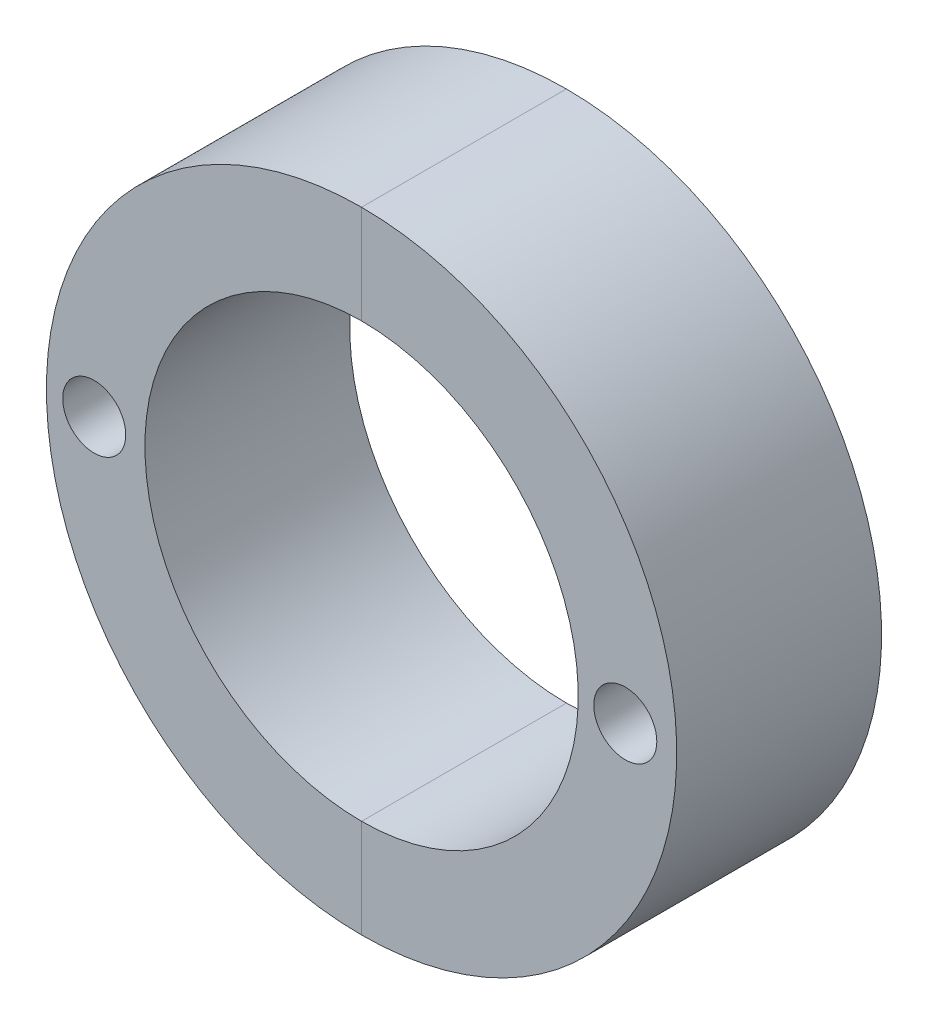
ISO-10303-21;
HEADER;
FILE_DESCRIPTION(('STEP AP214'),'2;1');
FILE_NAME('part.step','',(''),(''),'','','');
FILE_SCHEMA(('AUTOMOTIVE_DESIGN { 1 0 10303 214 1 1 1 1 }'));
ENDSEC;
DATA;
#1=APPLICATION_CONTEXT('core data for automotive mechanical design processes');
#2=APPLICATION_PROTOCOL_DEFINITION('international standard','automotive_design',2000,#1);
#3=PRODUCT_CONTEXT('',#1,'mechanical');
#4=PRODUCT('Part','Part','',(#3));
#5=PRODUCT_RELATED_PRODUCT_CATEGORY('part','',(#4));
#6=PRODUCT_DEFINITION_FORMATION('','',#4);
#7=PRODUCT_DEFINITION_CONTEXT('part definition',#1,'design');
#8=PRODUCT_DEFINITION('design','',#6,#7);
#9=PRODUCT_DEFINITION_SHAPE('','',#8);
#10=(LENGTH_UNIT() NAMED_UNIT(*) SI_UNIT(.MILLI.,.METRE.));
#11=(NAMED_UNIT(*) PLANE_ANGLE_UNIT() SI_UNIT($,.RADIAN.));
#12=(NAMED_UNIT(*) SI_UNIT($,.STERADIAN.) SOLID_ANGLE_UNIT());
#13=UNCERTAINTY_MEASURE_WITH_UNIT(LENGTH_MEASURE(1.E-05),#10,'distance_accuracy_value','');
#14=(GEOMETRIC_REPRESENTATION_CONTEXT(3) GLOBAL_UNCERTAINTY_ASSIGNED_CONTEXT((#13)) GLOBAL_UNIT_ASSIGNED_CONTEXT((#10,
#11,#12)) REPRESENTATION_CONTEXT('',''));
#15=CARTESIAN_POINT('',(0.,0.,0.));
#16=DIRECTION('',(0.,0.,1.));
#17=DIRECTION('',(1.,0.,0.));
#18=AXIS2_PLACEMENT_3D('',#15,#16,#17);
#19=CARTESIAN_POINT('',(0.,44.4067535270988,-0.01));
#20=DIRECTION('',(-1.,0.,0.));
#21=DIRECTION('',(0.,0.,1.));
#22=AXIS2_PLACEMENT_3D('',#19,#20,#21);
#23=PLANE('',#22);
#24=DIRECTION('',(0.,-1.,0.));
#25=VECTOR('',#24,1.);
#26=CARTESIAN_POINT('',(0.,0.,0.));
#27=LINE('',#26,#25);
#28=CARTESIAN_POINT('',(0.,-27.5,0.));
#29=VERTEX_POINT('',#28);
#30=CARTESIAN_POINT('',(0.,-40.,0.));
#31=VERTEX_POINT('',#30);
#32=EDGE_CURVE('E123',#29,#31,#27,.T.);
#33=ORIENTED_EDGE('',*,*,#32,.T.);
#34=DIRECTION('',(0.,0.,-1.));
#35=VECTOR('',#34,1.);
#36=CARTESIAN_POINT('',(0.,-40.,26.));
#37=LINE('',#36,#35);
#38=CARTESIAN_POINT('',(0.,-40.,26.));
#39=VERTEX_POINT('',#38);
#40=EDGE_CURVE('E128',#31,#39,#37,.F.);
#41=ORIENTED_EDGE('',*,*,#40,.T.);
#42=DIRECTION('',(0.,-1.,0.));
#43=VECTOR('',#42,1.);
#44=CARTESIAN_POINT('',(0.,0.,26.));
#45=LINE('',#44,#43);
#46=CARTESIAN_POINT('',(0.,-27.5,26.));
#47=VERTEX_POINT('',#46);
#48=EDGE_CURVE('E100',#47,#39,#45,.T.);
#49=ORIENTED_EDGE('',*,*,#48,.F.);
#50=DIRECTION('',(0.,0.,1.));
#51=VECTOR('',#50,1.);
#52=CARTESIAN_POINT('',(0.,-27.5,0.));
#53=LINE('',#52,#51);
#54=EDGE_CURVE('E135',#47,#29,#53,.F.);
#55=ORIENTED_EDGE('',*,*,#54,.T.);
#56=EDGE_LOOP('',(#33,#41,#49,#55));
#57=FACE_BOUND('',#56,.T.);
#58=ADVANCED_FACE('F74',(#57),#23,.T.);
#59=CARTESIAN_POINT('',(0.,40.,26.));
#60=VERTEX_POINT('',#59);
#61=CARTESIAN_POINT('',(0.,27.5,26.));
#62=VERTEX_POINT('',#61);
#63=EDGE_CURVE('E90',#60,#62,#45,.T.);
#64=ORIENTED_EDGE('',*,*,#63,.F.);
#65=DIRECTION('',(0.,0.,-1.));
#66=VECTOR('',#65,1.);
#67=CARTESIAN_POINT('',(0.,40.,26.));
#68=LINE('',#67,#66);
#69=CARTESIAN_POINT('',(0.,40.,0.));
#70=VERTEX_POINT('',#69);
#71=EDGE_CURVE('E129',#60,#70,#68,.T.);
#72=ORIENTED_EDGE('',*,*,#71,.T.);
#73=CARTESIAN_POINT('',(0.,27.5,0.));
#74=VERTEX_POINT('',#73);
#75=EDGE_CURVE('E118',#70,#74,#27,.T.);
#76=ORIENTED_EDGE('',*,*,#75,.T.);
#77=DIRECTION('',(0.,0.,1.));
#78=VECTOR('',#77,1.);
#79=CARTESIAN_POINT('',(0.,27.5,0.));
#80=LINE('',#79,#78);
#81=EDGE_CURVE('E126',#74,#62,#80,.T.);
#82=ORIENTED_EDGE('',*,*,#81,.T.);
#83=EDGE_LOOP('',(#64,#72,#76,#82));
#84=FACE_BOUND('',#83,.T.);
#85=ADVANCED_FACE('F130',(#84),#23,.T.);
#86=CARTESIAN_POINT('',(0.,0.,26.));
#87=DIRECTION('',(0.,0.,-1.));
#88=DIRECTION('',(-1.,0.,0.));
#89=AXIS2_PLACEMENT_3D('',#86,#87,#88);
#90=CYLINDRICAL_SURFACE('',#89,40.);
#91=ORIENTED_EDGE('',*,*,#71,.F.);
#92=CARTESIAN_POINT('',(0.,0.,26.));
#93=DIRECTION('',(0.,0.,1.));
#94=DIRECTION('',(1.,0.,0.));
#95=AXIS2_PLACEMENT_3D('',#92,#93,#94);
#96=CIRCLE('',#95,40.);
#97=EDGE_CURVE('E136',#39,#60,#96,.T.);
#98=ORIENTED_EDGE('',*,*,#97,.F.);
#99=ORIENTED_EDGE('',*,*,#40,.F.);
#100=CARTESIAN_POINT('',(0.,0.,0.));
#101=DIRECTION('',(0.,0.,1.));
#102=DIRECTION('',(1.,0.,0.));
#103=AXIS2_PLACEMENT_3D('',#100,#101,#102);
#104=CIRCLE('',#103,40.);
#105=EDGE_CURVE('E127',#31,#70,#104,.T.);
#106=ORIENTED_EDGE('',*,*,#105,.T.);
#107=EDGE_LOOP('',(#91,#98,#99,#106));
#108=FACE_BOUND('',#107,.T.);
#109=ADVANCED_FACE('F145',(#108),#90,.T.);
#110=CARTESIAN_POINT('',(0.,0.,26.));
#111=DIRECTION('',(0.,0.,1.));
#112=DIRECTION('',(1.,0.,0.));
#113=AXIS2_PLACEMENT_3D('',#110,#111,#112);
#114=PLANE('',#113);
#115=CARTESIAN_POINT('',(33.4719622595131,0.,26.));
#116=DIRECTION('',(0.,0.,1.));
#117=DIRECTION('',(1.,0.,0.));
#118=AXIS2_PLACEMENT_3D('',#115,#116,#117);
#119=CIRCLE('',#118,4.00000000000001);
#120=CARTESIAN_POINT('',(37.4719622595131,0.,26.));
#121=VERTEX_POINT('',#120);
#122=EDGE_CURVE('E139',#121,#121,#119,.T.);
#123=ORIENTED_EDGE('',*,*,#122,.F.);
#124=EDGE_LOOP('',(#123));
#125=FACE_BOUND('',#124,.T.);
#126=ORIENTED_EDGE('',*,*,#97,.T.);
#127=ORIENTED_EDGE('',*,*,#63,.T.);
#128=CARTESIAN_POINT('',(0.,0.,26.));
#129=DIRECTION('',(0.,0.,1.));
#130=DIRECTION('',(1.,0.,0.));
#131=AXIS2_PLACEMENT_3D('',#128,#129,#130);
#132=CIRCLE('',#131,27.5);
#133=EDGE_CURVE('E15',#47,#62,#132,.T.);
#134=ORIENTED_EDGE('',*,*,#133,.F.);
#135=ORIENTED_EDGE('',*,*,#48,.T.);
#136=EDGE_LOOP('',(#126,#127,#134,#135));
#137=FACE_BOUND('',#136,.T.);
#138=ADVANCED_FACE('F156',(#125,#137),#114,.T.);
#139=CARTESIAN_POINT('',(0.,0.,0.));
#140=DIRECTION('',(0.,0.,1.));
#141=DIRECTION('',(1.,0.,0.));
#142=AXIS2_PLACEMENT_3D('',#139,#140,#141);
#143=PLANE('',#142);
#144=CARTESIAN_POINT('',(33.4719622595131,0.,0.));
#145=DIRECTION('',(0.,0.,1.));
#146=DIRECTION('',(1.,0.,0.));
#147=AXIS2_PLACEMENT_3D('',#144,#145,#146);
#148=CIRCLE('',#147,4.00000000000001);
#149=CARTESIAN_POINT('',(37.4719622595131,0.,0.));
#150=VERTEX_POINT('',#149);
#151=EDGE_CURVE('E132',#150,#150,#148,.T.);
#152=ORIENTED_EDGE('',*,*,#151,.T.);
#153=EDGE_LOOP('',(#152));
#154=FACE_BOUND('',#153,.T.);
#155=ORIENTED_EDGE('',*,*,#75,.F.);
#156=ORIENTED_EDGE('',*,*,#105,.F.);
#157=ORIENTED_EDGE('',*,*,#32,.F.);
#158=CARTESIAN_POINT('',(0.,0.,0.));
#159=DIRECTION('',(0.,0.,1.));
#160=DIRECTION('',(1.,0.,0.));
#161=AXIS2_PLACEMENT_3D('',#158,#159,#160);
#162=CIRCLE('',#161,27.5);
#163=EDGE_CURVE('E84',#29,#74,#162,.T.);
#164=ORIENTED_EDGE('',*,*,#163,.T.);
#165=EDGE_LOOP('',(#155,#156,#157,#164));
#166=FACE_BOUND('',#165,.T.);
#167=ADVANCED_FACE('F117',(#154,#166),#143,.F.);
#168=CARTESIAN_POINT('',(0.,0.,0.));
#169=DIRECTION('',(0.,0.,1.));
#170=DIRECTION('',(1.,0.,0.));
#171=AXIS2_PLACEMENT_3D('',#168,#169,#170);
#172=CYLINDRICAL_SURFACE('',#171,27.5);
#173=ORIENTED_EDGE('',*,*,#54,.F.);
#174=ORIENTED_EDGE('',*,*,#133,.T.);
#175=ORIENTED_EDGE('',*,*,#81,.F.);
#176=ORIENTED_EDGE('',*,*,#163,.F.);
#177=EDGE_LOOP('',(#173,#174,#175,#176));
#178=FACE_BOUND('',#177,.T.);
#179=ADVANCED_FACE('F76',(#178),#172,.F.);
#180=CARTESIAN_POINT('',(33.4719622595131,0.,0.));
#181=DIRECTION('',(0.,0.,1.));
#182=DIRECTION('',(1.,0.,0.));
#183=AXIS2_PLACEMENT_3D('',#180,#181,#182);
#184=CYLINDRICAL_SURFACE('',#183,4.00000000000001);
#185=ORIENTED_EDGE('',*,*,#151,.F.);
#186=EDGE_LOOP('',(#185));
#187=FACE_BOUND('',#186,.T.);
#188=ORIENTED_EDGE('',*,*,#122,.T.);
#189=EDGE_LOOP('',(#188));
#190=FACE_BOUND('',#189,.T.);
#191=ADVANCED_FACE('F152',(#187,#190),#184,.F.);
#192=CLOSED_SHELL('',(#58,#85,#109,#138,#167,#179,#191));
#193=MANIFOLD_SOLID_BREP('B2',#192);
#194=CARTESIAN_POINT('',(0.,44.4067535270988,-0.01));
#195=DIRECTION('',(-1.,0.,0.));
#196=DIRECTION('',(0.,0.,1.));
#197=AXIS2_PLACEMENT_3D('',#194,#195,#196);
#198=PLANE('',#197);
#199=DIRECTION('',(0.,-1.,0.));
#200=VECTOR('',#199,1.);
#201=CARTESIAN_POINT('',(0.,0.,0.));
#202=LINE('',#201,#200);
#203=CARTESIAN_POINT('',(0.,-27.5,0.));
#204=VERTEX_POINT('',#203);
#205=CARTESIAN_POINT('',(0.,-40.,0.));
#206=VERTEX_POINT('',#205);
#207=EDGE_CURVE('E270',#204,#206,#202,.T.);
#208=ORIENTED_EDGE('',*,*,#207,.F.);
#209=DIRECTION('',(0.,0.,1.));
#210=VECTOR('',#209,1.);
#211=CARTESIAN_POINT('',(0.,-27.5,0.));
#212=LINE('',#211,#210);
#213=CARTESIAN_POINT('',(0.,-27.5,26.));
#214=VERTEX_POINT('',#213);
#215=EDGE_CURVE('E273',#214,#204,#212,.F.);
#216=ORIENTED_EDGE('',*,*,#215,.F.);
#217=DIRECTION('',(0.,-1.,0.));
#218=VECTOR('',#217,1.);
#219=CARTESIAN_POINT('',(0.,0.,26.));
#220=LINE('',#219,#218);
#221=CARTESIAN_POINT('',(0.,-40.,26.));
#222=VERTEX_POINT('',#221);
#223=EDGE_CURVE('E75',#214,#222,#220,.T.);
#224=ORIENTED_EDGE('',*,*,#223,.T.);
#225=DIRECTION('',(0.,0.,-1.));
#226=VECTOR('',#225,1.);
#227=CARTESIAN_POINT('',(0.,-40.,26.));
#228=LINE('',#227,#226);
#229=EDGE_CURVE('E222',#206,#222,#228,.F.);
#230=ORIENTED_EDGE('',*,*,#229,.F.);
#231=EDGE_LOOP('',(#208,#216,#224,#230));
#232=FACE_BOUND('',#231,.T.);
#233=ADVANCED_FACE('F217',(#232),#198,.F.);
#234=CARTESIAN_POINT('',(0.,40.,26.));
#235=VERTEX_POINT('',#234);
#236=CARTESIAN_POINT('',(0.,27.5,26.));
#237=VERTEX_POINT('',#236);
#238=EDGE_CURVE('E226',#235,#237,#220,.T.);
#239=ORIENTED_EDGE('',*,*,#238,.T.);
#240=DIRECTION('',(0.,0.,1.));
#241=VECTOR('',#240,1.);
#242=CARTESIAN_POINT('',(0.,27.5,0.));
#243=LINE('',#242,#241);
#244=CARTESIAN_POINT('',(0.,27.5,0.));
#245=VERTEX_POINT('',#244);
#246=EDGE_CURVE('E267',#245,#237,#243,.T.);
#247=ORIENTED_EDGE('',*,*,#246,.F.);
#248=CARTESIAN_POINT('',(0.,40.,0.));
#249=VERTEX_POINT('',#248);
#250=EDGE_CURVE('E257',#249,#245,#202,.T.);
#251=ORIENTED_EDGE('',*,*,#250,.F.);
#252=DIRECTION('',(0.,0.,-1.));
#253=VECTOR('',#252,1.);
#254=CARTESIAN_POINT('',(0.,40.,26.));
#255=LINE('',#254,#253);
#256=EDGE_CURVE('E235',#235,#249,#255,.T.);
#257=ORIENTED_EDGE('',*,*,#256,.F.);
#258=EDGE_LOOP('',(#239,#247,#251,#257));
#259=FACE_BOUND('',#258,.T.);
#260=ADVANCED_FACE('F269',(#259),#198,.F.);
#261=CARTESIAN_POINT('',(0.,0.,26.));
#262=DIRECTION('',(0.,0.,-1.));
#263=DIRECTION('',(-1.,0.,0.));
#264=AXIS2_PLACEMENT_3D('',#261,#262,#263);
#265=CYLINDRICAL_SURFACE('',#264,40.);
#266=CARTESIAN_POINT('',(0.,0.,26.));
#267=DIRECTION('',(0.,0.,1.));
#268=DIRECTION('',(1.,0.,0.));
#269=AXIS2_PLACEMENT_3D('',#266,#267,#268);
#270=CIRCLE('',#269,40.);
#271=EDGE_CURVE('E274',#235,#222,#270,.T.);
#272=ORIENTED_EDGE('',*,*,#271,.F.);
#273=ORIENTED_EDGE('',*,*,#256,.T.);
#274=CARTESIAN_POINT('',(0.,0.,0.));
#275=DIRECTION('',(0.,0.,1.));
#276=DIRECTION('',(1.,0.,0.));
#277=AXIS2_PLACEMENT_3D('',#274,#275,#276);
#278=CIRCLE('',#277,40.);
#279=EDGE_CURVE('E266',#249,#206,#278,.T.);
#280=ORIENTED_EDGE('',*,*,#279,.T.);
#281=ORIENTED_EDGE('',*,*,#229,.T.);
#282=EDGE_LOOP('',(#272,#273,#280,#281));
#283=FACE_BOUND('',#282,.T.);
#284=ADVANCED_FACE('F292',(#283),#265,.T.);
#285=CARTESIAN_POINT('',(0.,0.,0.));
#286=DIRECTION('',(0.,0.,1.));
#287=DIRECTION('',(1.,0.,0.));
#288=AXIS2_PLACEMENT_3D('',#285,#286,#287);
#289=PLANE('',#288);
#290=CARTESIAN_POINT('',(-33.9316787645907,0.,0.));
#291=DIRECTION('',(0.,0.,1.));
#292=DIRECTION('',(1.,0.,0.));
#293=AXIS2_PLACEMENT_3D('',#290,#291,#292);
#294=CIRCLE('',#293,4.);
#295=CARTESIAN_POINT('',(-29.9316787645907,0.,0.));
#296=VERTEX_POINT('',#295);
#297=EDGE_CURVE('E288',#296,#296,#294,.T.);
#298=ORIENTED_EDGE('',*,*,#297,.T.);
#299=EDGE_LOOP('',(#298));
#300=FACE_BOUND('',#299,.T.);
#301=ORIENTED_EDGE('',*,*,#279,.F.);
#302=ORIENTED_EDGE('',*,*,#250,.T.);
#303=CARTESIAN_POINT('',(0.,0.,0.));
#304=DIRECTION('',(0.,0.,1.));
#305=DIRECTION('',(1.,0.,0.));
#306=AXIS2_PLACEMENT_3D('',#303,#304,#305);
#307=CIRCLE('',#306,27.5);
#308=EDGE_CURVE('E264',#245,#204,#307,.T.);
#309=ORIENTED_EDGE('',*,*,#308,.T.);
#310=ORIENTED_EDGE('',*,*,#207,.T.);
#311=EDGE_LOOP('',(#301,#302,#309,#310));
#312=FACE_BOUND('',#311,.T.);
#313=ADVANCED_FACE('F265',(#300,#312),#289,.F.);
#314=CARTESIAN_POINT('',(0.,0.,26.));
#315=DIRECTION('',(0.,0.,1.));
#316=DIRECTION('',(1.,0.,0.));
#317=AXIS2_PLACEMENT_3D('',#314,#315,#316);
#318=PLANE('',#317);
#319=CARTESIAN_POINT('',(-33.9316787645907,0.,26.));
#320=DIRECTION('',(0.,0.,1.));
#321=DIRECTION('',(1.,0.,0.));
#322=AXIS2_PLACEMENT_3D('',#319,#320,#321);
#323=CIRCLE('',#322,4.);
#324=CARTESIAN_POINT('',(-29.9316787645907,0.,26.));
#325=VERTEX_POINT('',#324);
#326=EDGE_CURVE('E282',#325,#325,#323,.T.);
#327=ORIENTED_EDGE('',*,*,#326,.F.);
#328=EDGE_LOOP('',(#327));
#329=FACE_BOUND('',#328,.T.);
#330=ORIENTED_EDGE('',*,*,#238,.F.);
#331=ORIENTED_EDGE('',*,*,#271,.T.);
#332=ORIENTED_EDGE('',*,*,#223,.F.);
#333=CARTESIAN_POINT('',(0.,0.,26.));
#334=DIRECTION('',(0.,0.,1.));
#335=DIRECTION('',(1.,0.,0.));
#336=AXIS2_PLACEMENT_3D('',#333,#334,#335);
#337=CIRCLE('',#336,27.5);
#338=EDGE_CURVE('E278',#237,#214,#337,.T.);
#339=ORIENTED_EDGE('',*,*,#338,.F.);
#340=EDGE_LOOP('',(#330,#331,#332,#339));
#341=FACE_BOUND('',#340,.T.);
#342=ADVANCED_FACE('F291',(#329,#341),#318,.T.);
#343=CARTESIAN_POINT('',(0.,0.,0.));
#344=DIRECTION('',(0.,0.,1.));
#345=DIRECTION('',(1.,0.,0.));
#346=AXIS2_PLACEMENT_3D('',#343,#344,#345);
#347=CYLINDRICAL_SURFACE('',#346,27.5);
#348=ORIENTED_EDGE('',*,*,#338,.T.);
#349=ORIENTED_EDGE('',*,*,#215,.T.);
#350=ORIENTED_EDGE('',*,*,#308,.F.);
#351=ORIENTED_EDGE('',*,*,#246,.T.);
#352=EDGE_LOOP('',(#348,#349,#350,#351));
#353=FACE_BOUND('',#352,.T.);
#354=ADVANCED_FACE('F280',(#353),#347,.F.);
#355=CARTESIAN_POINT('',(-33.9316787645907,0.,0.));
#356=DIRECTION('',(0.,0.,1.));
#357=DIRECTION('',(1.,0.,0.));
#358=AXIS2_PLACEMENT_3D('',#355,#356,#357);
#359=CYLINDRICAL_SURFACE('',#358,4.);
#360=ORIENTED_EDGE('',*,*,#297,.F.);
#361=EDGE_LOOP('',(#360));
#362=FACE_BOUND('',#361,.T.);
#363=ORIENTED_EDGE('',*,*,#326,.T.);
#364=EDGE_LOOP('',(#363));
#365=FACE_BOUND('',#364,.T.);
#366=ADVANCED_FACE('F304',(#362,#365),#359,.F.);
#367=CLOSED_SHELL('',(#233,#260,#284,#313,#342,#354,#366));
#368=MANIFOLD_SOLID_BREP('B9',#367);
#369=ADVANCED_BREP_SHAPE_REPRESENTATION('',(#18,#193,#368),#14);
#370=SHAPE_DEFINITION_REPRESENTATION(#9,#369);
ENDSEC;
END-ISO-10303-21;
